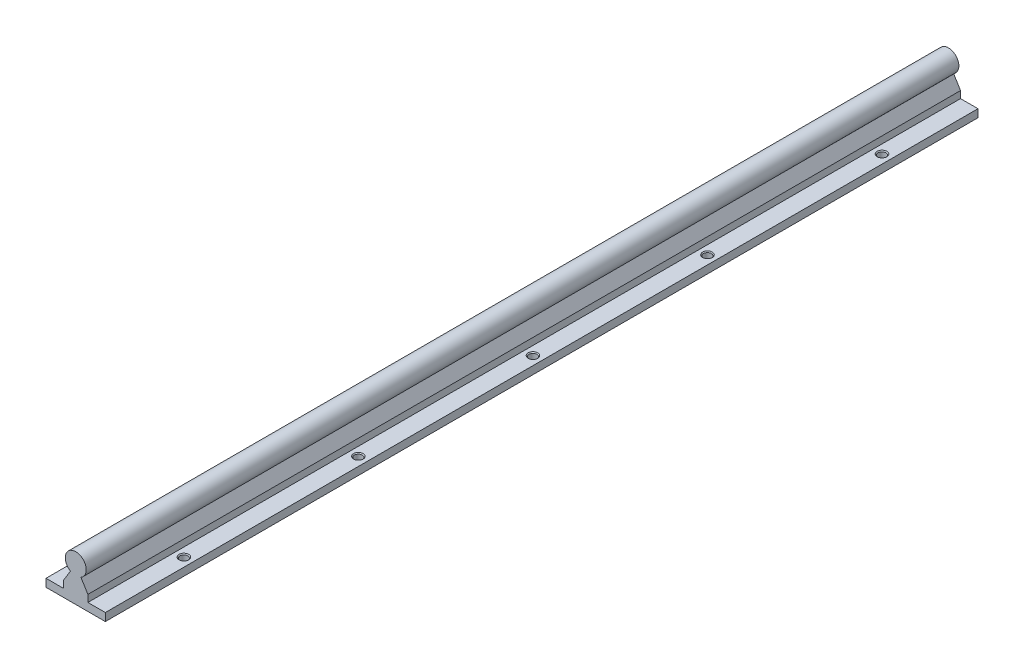
ISO-10303-21;
HEADER;
FILE_DESCRIPTION(('STEP AP214'),'2;1');
FILE_NAME('part.step','',(''),(''),'','','');
FILE_SCHEMA(('AUTOMOTIVE_DESIGN { 1 0 10303 214 1 1 1 1 }'));
ENDSEC;
DATA;
#1=APPLICATION_CONTEXT('core data for automotive mechanical design processes');
#2=APPLICATION_PROTOCOL_DEFINITION('international standard','automotive_design',2000,#1);
#3=PRODUCT_CONTEXT('',#1,'mechanical');
#4=PRODUCT('Part','Part','',(#3));
#5=PRODUCT_RELATED_PRODUCT_CATEGORY('part','',(#4));
#6=PRODUCT_DEFINITION_FORMATION('','',#4);
#7=PRODUCT_DEFINITION_CONTEXT('part definition',#1,'design');
#8=PRODUCT_DEFINITION('design','',#6,#7);
#9=PRODUCT_DEFINITION_SHAPE('','',#8);
#10=(LENGTH_UNIT() NAMED_UNIT(*) SI_UNIT(.MILLI.,.METRE.));
#11=(NAMED_UNIT(*) PLANE_ANGLE_UNIT() SI_UNIT($,.RADIAN.));
#12=(NAMED_UNIT(*) SI_UNIT($,.STERADIAN.) SOLID_ANGLE_UNIT());
#13=UNCERTAINTY_MEASURE_WITH_UNIT(LENGTH_MEASURE(1.E-05),#10,'distance_accuracy_value','');
#14=(GEOMETRIC_REPRESENTATION_CONTEXT(3) GLOBAL_UNCERTAINTY_ASSIGNED_CONTEXT((#13)) GLOBAL_UNIT_ASSIGNED_CONTEXT((#10,
#11,#12)) REPRESENTATION_CONTEXT('',''));
#15=CARTESIAN_POINT('',(0.,0.,0.));
#16=DIRECTION('',(0.,0.,1.));
#17=DIRECTION('',(1.,0.,0.));
#18=AXIS2_PLACEMENT_3D('',#15,#16,#17);
#19=CARTESIAN_POINT('',(-38.8854512776642,-15.3216429533087,500.));
#20=DIRECTION('',(1.,0.,0.));
#21=DIRECTION('',(0.,0.,-1.));
#22=AXIS2_PLACEMENT_3D('',#19,#20,#21);
#23=PLANE('',#22);
#24=DIRECTION('',(0.,-1.,0.));
#25=VECTOR('',#24,1.);
#26=CARTESIAN_POINT('',(-38.8854512776642,-15.3216429533087,0.));
#27=LINE('',#26,#25);
#28=CARTESIAN_POINT('',(-38.8854512776642,-15.3216429533087,0.));
#29=VERTEX_POINT('',#28);
#30=CARTESIAN_POINT('',(-38.8854512776642,-19.8216429533087,0.));
#31=VERTEX_POINT('',#30);
#32=EDGE_CURVE('E144',#29,#31,#27,.T.);
#33=ORIENTED_EDGE('',*,*,#32,.T.);
#34=DIRECTION('',(0.,0.,-1.));
#35=VECTOR('',#34,1.);
#36=CARTESIAN_POINT('',(-38.8854512776642,-19.8216429533087,500.));
#37=LINE('',#36,#35);
#38=CARTESIAN_POINT('',(-38.8854512776642,-19.8216429533087,500.));
#39=VERTEX_POINT('',#38);
#40=EDGE_CURVE('E11',#39,#31,#37,.T.);
#41=ORIENTED_EDGE('',*,*,#40,.F.);
#42=DIRECTION('',(0.,-1.,0.));
#43=VECTOR('',#42,1.);
#44=CARTESIAN_POINT('',(-38.8854512776642,-15.3216429533087,500.));
#45=LINE('',#44,#43);
#46=CARTESIAN_POINT('',(-38.8854512776642,-15.3216429533087,500.));
#47=VERTEX_POINT('',#46);
#48=EDGE_CURVE('E163',#47,#39,#45,.T.);
#49=ORIENTED_EDGE('',*,*,#48,.F.);
#50=DIRECTION('',(0.,0.,-1.));
#51=VECTOR('',#50,1.);
#52=CARTESIAN_POINT('',(-38.8854512776642,-15.3216429533087,500.));
#53=LINE('',#52,#51);
#54=EDGE_CURVE('E140',#47,#29,#53,.T.);
#55=ORIENTED_EDGE('',*,*,#54,.T.);
#56=EDGE_LOOP('',(#33,#41,#49,#55));
#57=FACE_BOUND('',#56,.T.);
#58=ADVANCED_FACE('F36',(#57),#23,.F.);
#59=CARTESIAN_POINT('',(-38.8854512776642,-19.8216429533087,500.));
#60=DIRECTION('',(0.,1.,0.));
#61=DIRECTION('',(0.,0.,1.));
#62=AXIS2_PLACEMENT_3D('',#59,#60,#61);
#63=PLANE('',#62);
#64=CARTESIAN_POINT('',(-33.8854512776642,-19.8216429533087,50.));
#65=DIRECTION('',(0.,1.,0.));
#66=DIRECTION('',(0.,0.,1.));
#67=AXIS2_PLACEMENT_3D('',#64,#65,#66);
#68=CIRCLE('',#67,2.25);
#69=CARTESIAN_POINT('',(-33.8854512776642,-19.8216429533087,52.25));
#70=VERTEX_POINT('',#69);
#71=EDGE_CURVE('E290',#70,#70,#68,.T.);
#72=ORIENTED_EDGE('',*,*,#71,.T.);
#73=EDGE_LOOP('',(#72));
#74=FACE_BOUND('',#73,.T.);
#75=CARTESIAN_POINT('',(-33.8854512776642,-19.8216429533087,150.));
#76=DIRECTION('',(0.,1.,0.));
#77=DIRECTION('',(0.,0.,1.));
#78=AXIS2_PLACEMENT_3D('',#75,#76,#77);
#79=CIRCLE('',#78,2.25);
#80=CARTESIAN_POINT('',(-33.8854512776642,-19.8216429533087,152.25));
#81=VERTEX_POINT('',#80);
#82=EDGE_CURVE('E281',#81,#81,#79,.T.);
#83=ORIENTED_EDGE('',*,*,#82,.T.);
#84=EDGE_LOOP('',(#83));
#85=FACE_BOUND('',#84,.T.);
#86=CARTESIAN_POINT('',(-33.8854512776642,-19.8216429533087,250.));
#87=DIRECTION('',(0.,1.,0.));
#88=DIRECTION('',(0.,0.,1.));
#89=AXIS2_PLACEMENT_3D('',#86,#87,#88);
#90=CIRCLE('',#89,2.25);
#91=CARTESIAN_POINT('',(-33.8854512776642,-19.8216429533087,252.25));
#92=VERTEX_POINT('',#91);
#93=EDGE_CURVE('E272',#92,#92,#90,.T.);
#94=ORIENTED_EDGE('',*,*,#93,.T.);
#95=EDGE_LOOP('',(#94));
#96=FACE_BOUND('',#95,.T.);
#97=CARTESIAN_POINT('',(-9.88545127766421,-19.8216429533087,250.));
#98=DIRECTION('',(0.,1.,0.));
#99=DIRECTION('',(0.,0.,1.));
#100=AXIS2_PLACEMENT_3D('',#97,#98,#99);
#101=CIRCLE('',#100,2.25);
#102=CARTESIAN_POINT('',(-9.88545127766421,-19.8216429533087,252.25));
#103=VERTEX_POINT('',#102);
#104=EDGE_CURVE('E263',#103,#103,#101,.T.);
#105=ORIENTED_EDGE('',*,*,#104,.T.);
#106=EDGE_LOOP('',(#105));
#107=FACE_BOUND('',#106,.T.);
#108=CARTESIAN_POINT('',(-9.88545127766421,-19.8216429533087,150.));
#109=DIRECTION('',(0.,1.,0.));
#110=DIRECTION('',(0.,0.,1.));
#111=AXIS2_PLACEMENT_3D('',#108,#109,#110);
#112=CIRCLE('',#111,2.25);
#113=CARTESIAN_POINT('',(-9.88545127766421,-19.8216429533087,152.25));
#114=VERTEX_POINT('',#113);
#115=EDGE_CURVE('E254',#114,#114,#112,.T.);
#116=ORIENTED_EDGE('',*,*,#115,.T.);
#117=EDGE_LOOP('',(#116));
#118=FACE_BOUND('',#117,.T.);
#119=CARTESIAN_POINT('',(-9.88545127766421,-19.8216429533087,50.));
#120=DIRECTION('',(0.,1.,0.));
#121=DIRECTION('',(0.,0.,1.));
#122=AXIS2_PLACEMENT_3D('',#119,#120,#121);
#123=CIRCLE('',#122,2.25);
#124=CARTESIAN_POINT('',(-9.88545127766421,-19.8216429533087,52.25));
#125=VERTEX_POINT('',#124);
#126=EDGE_CURVE('E245',#125,#125,#123,.T.);
#127=ORIENTED_EDGE('',*,*,#126,.T.);
#128=EDGE_LOOP('',(#127));
#129=FACE_BOUND('',#128,.T.);
#130=CARTESIAN_POINT('',(-9.88545127766421,-19.8216429533087,350.));
#131=DIRECTION('',(0.,1.,0.));
#132=DIRECTION('',(0.,0.,1.));
#133=AXIS2_PLACEMENT_3D('',#130,#131,#132);
#134=CIRCLE('',#133,2.25);
#135=CARTESIAN_POINT('',(-9.88545127766421,-19.8216429533087,352.25));
#136=VERTEX_POINT('',#135);
#137=EDGE_CURVE('E236',#136,#136,#134,.T.);
#138=ORIENTED_EDGE('',*,*,#137,.T.);
#139=EDGE_LOOP('',(#138));
#140=FACE_BOUND('',#139,.T.);
#141=CARTESIAN_POINT('',(-9.88545127766421,-19.8216429533087,450.));
#142=DIRECTION('',(0.,1.,0.));
#143=DIRECTION('',(0.,0.,1.));
#144=AXIS2_PLACEMENT_3D('',#141,#142,#143);
#145=CIRCLE('',#144,2.25);
#146=CARTESIAN_POINT('',(-9.88545127766421,-19.8216429533087,452.25));
#147=VERTEX_POINT('',#146);
#148=EDGE_CURVE('E227',#147,#147,#145,.T.);
#149=ORIENTED_EDGE('',*,*,#148,.T.);
#150=EDGE_LOOP('',(#149));
#151=FACE_BOUND('',#150,.T.);
#152=CARTESIAN_POINT('',(-33.8854512776642,-19.8216429533087,350.));
#153=DIRECTION('',(0.,1.,0.));
#154=DIRECTION('',(0.,0.,1.));
#155=AXIS2_PLACEMENT_3D('',#152,#153,#154);
#156=CIRCLE('',#155,2.25);
#157=CARTESIAN_POINT('',(-33.8854512776642,-19.8216429533087,352.25));
#158=VERTEX_POINT('',#157);
#159=EDGE_CURVE('E218',#158,#158,#156,.T.);
#160=ORIENTED_EDGE('',*,*,#159,.T.);
#161=EDGE_LOOP('',(#160));
#162=FACE_BOUND('',#161,.T.);
#163=CARTESIAN_POINT('',(-33.8854512776642,-19.8216429533087,450.));
#164=DIRECTION('',(0.,1.,0.));
#165=DIRECTION('',(0.,0.,1.));
#166=AXIS2_PLACEMENT_3D('',#163,#164,#165);
#167=CIRCLE('',#166,2.25);
#168=CARTESIAN_POINT('',(-33.8854512776642,-19.8216429533087,452.25));
#169=VERTEX_POINT('',#168);
#170=EDGE_CURVE('E148',#169,#169,#167,.T.);
#171=ORIENTED_EDGE('',*,*,#170,.T.);
#172=EDGE_LOOP('',(#171));
#173=FACE_BOUND('',#172,.T.);
#174=DIRECTION('',(1.,0.,0.));
#175=VECTOR('',#174,1.);
#176=CARTESIAN_POINT('',(-38.8854512776642,-19.8216429533087,0.));
#177=LINE('',#176,#175);
#178=CARTESIAN_POINT('',(-4.88545127766421,-19.8216429533087,0.));
#179=VERTEX_POINT('',#178);
#180=EDGE_CURVE('E147',#31,#179,#177,.T.);
#181=ORIENTED_EDGE('',*,*,#180,.T.);
#182=DIRECTION('',(0.,0.,-1.));
#183=VECTOR('',#182,1.);
#184=CARTESIAN_POINT('',(-4.88545127766421,-19.8216429533087,500.));
#185=LINE('',#184,#183);
#186=CARTESIAN_POINT('',(-4.88545127766421,-19.8216429533087,500.));
#187=VERTEX_POINT('',#186);
#188=EDGE_CURVE('E44',#187,#179,#185,.T.);
#189=ORIENTED_EDGE('',*,*,#188,.F.);
#190=DIRECTION('',(1.,0.,0.));
#191=VECTOR('',#190,1.);
#192=CARTESIAN_POINT('',(-38.8854512776642,-19.8216429533087,500.));
#193=LINE('',#192,#191);
#194=EDGE_CURVE('E101',#39,#187,#193,.T.);
#195=ORIENTED_EDGE('',*,*,#194,.F.);
#196=ORIENTED_EDGE('',*,*,#40,.T.);
#197=EDGE_LOOP('',(#181,#189,#195,#196));
#198=FACE_BOUND('',#197,.T.);
#199=ADVANCED_FACE('F331',(#74,#85,#96,#107,#118,#129,#140,#151,#162,#173,#198),#63,.F.);
#200=CARTESIAN_POINT('',(-4.88545127766421,-19.8216429533087,500.));
#201=DIRECTION('',(-1.,0.,0.));
#202=DIRECTION('',(0.,0.,1.));
#203=AXIS2_PLACEMENT_3D('',#200,#201,#202);
#204=PLANE('',#203);
#205=DIRECTION('',(0.,1.,0.));
#206=VECTOR('',#205,1.);
#207=CARTESIAN_POINT('',(-4.88545127766421,-19.8216429533087,0.));
#208=LINE('',#207,#206);
#209=CARTESIAN_POINT('',(-4.88545127766421,-15.3216429533087,0.));
#210=VERTEX_POINT('',#209);
#211=EDGE_CURVE('E150',#179,#210,#208,.T.);
#212=ORIENTED_EDGE('',*,*,#211,.T.);
#213=DIRECTION('',(0.,0.,-1.));
#214=VECTOR('',#213,1.);
#215=CARTESIAN_POINT('',(-4.88545127766421,-15.3216429533087,500.));
#216=LINE('',#215,#214);
#217=CARTESIAN_POINT('',(-4.88545127766421,-15.3216429533087,500.));
#218=VERTEX_POINT('',#217);
#219=EDGE_CURVE('E176',#218,#210,#216,.T.);
#220=ORIENTED_EDGE('',*,*,#219,.F.);
#221=DIRECTION('',(0.,1.,0.));
#222=VECTOR('',#221,1.);
#223=CARTESIAN_POINT('',(-4.88545127766421,-19.8216429533087,500.));
#224=LINE('',#223,#222);
#225=EDGE_CURVE('E184',#187,#218,#224,.T.);
#226=ORIENTED_EDGE('',*,*,#225,.F.);
#227=ORIENTED_EDGE('',*,*,#188,.T.);
#228=EDGE_LOOP('',(#212,#220,#226,#227));
#229=FACE_BOUND('',#228,.T.);
#230=ADVANCED_FACE('F182',(#229),#204,.F.);
#231=CARTESIAN_POINT('',(-4.88545127766421,-15.3216429533087,500.));
#232=DIRECTION('',(0.,-1.,0.));
#233=DIRECTION('',(0.,0.,-1.));
#234=AXIS2_PLACEMENT_3D('',#231,#232,#233);
#235=PLANE('',#234);
#236=CARTESIAN_POINT('',(-9.88545127766421,-15.3216429533087,250.));
#237=DIRECTION('',(0.,1.,0.));
#238=DIRECTION('',(0.,0.,1.));
#239=AXIS2_PLACEMENT_3D('',#236,#237,#238);
#240=CIRCLE('',#239,2.75);
#241=CARTESIAN_POINT('',(-9.88545127766421,-15.3216429533087,252.75));
#242=VERTEX_POINT('',#241);
#243=EDGE_CURVE('E269',#242,#242,#240,.T.);
#244=ORIENTED_EDGE('',*,*,#243,.F.);
#245=EDGE_LOOP('',(#244));
#246=FACE_BOUND('',#245,.T.);
#247=CARTESIAN_POINT('',(-9.88545127766421,-15.3216429533087,150.));
#248=DIRECTION('',(0.,1.,0.));
#249=DIRECTION('',(0.,0.,1.));
#250=AXIS2_PLACEMENT_3D('',#247,#248,#249);
#251=CIRCLE('',#250,2.75);
#252=CARTESIAN_POINT('',(-9.88545127766421,-15.3216429533087,152.75));
#253=VERTEX_POINT('',#252);
#254=EDGE_CURVE('E260',#253,#253,#251,.T.);
#255=ORIENTED_EDGE('',*,*,#254,.F.);
#256=EDGE_LOOP('',(#255));
#257=FACE_BOUND('',#256,.T.);
#258=CARTESIAN_POINT('',(-9.88545127766421,-15.3216429533087,50.));
#259=DIRECTION('',(0.,1.,0.));
#260=DIRECTION('',(0.,0.,1.));
#261=AXIS2_PLACEMENT_3D('',#258,#259,#260);
#262=CIRCLE('',#261,2.75);
#263=CARTESIAN_POINT('',(-9.88545127766421,-15.3216429533087,52.75));
#264=VERTEX_POINT('',#263);
#265=EDGE_CURVE('E251',#264,#264,#262,.T.);
#266=ORIENTED_EDGE('',*,*,#265,.F.);
#267=EDGE_LOOP('',(#266));
#268=FACE_BOUND('',#267,.T.);
#269=CARTESIAN_POINT('',(-9.88545127766421,-15.3216429533087,350.));
#270=DIRECTION('',(0.,1.,0.));
#271=DIRECTION('',(0.,0.,1.));
#272=AXIS2_PLACEMENT_3D('',#269,#270,#271);
#273=CIRCLE('',#272,2.75);
#274=CARTESIAN_POINT('',(-9.88545127766421,-15.3216429533087,352.75));
#275=VERTEX_POINT('',#274);
#276=EDGE_CURVE('E242',#275,#275,#273,.T.);
#277=ORIENTED_EDGE('',*,*,#276,.F.);
#278=EDGE_LOOP('',(#277));
#279=FACE_BOUND('',#278,.T.);
#280=CARTESIAN_POINT('',(-9.88545127766421,-15.3216429533087,450.));
#281=DIRECTION('',(0.,1.,0.));
#282=DIRECTION('',(0.,0.,1.));
#283=AXIS2_PLACEMENT_3D('',#280,#281,#282);
#284=CIRCLE('',#283,2.75);
#285=CARTESIAN_POINT('',(-9.88545127766421,-15.3216429533087,452.75));
#286=VERTEX_POINT('',#285);
#287=EDGE_CURVE('E233',#286,#286,#284,.T.);
#288=ORIENTED_EDGE('',*,*,#287,.F.);
#289=EDGE_LOOP('',(#288));
#290=FACE_BOUND('',#289,.T.);
#291=DIRECTION('',(-1.,0.,0.));
#292=VECTOR('',#291,1.);
#293=CARTESIAN_POINT('',(-4.88545127766421,-15.3216429533087,0.));
#294=LINE('',#293,#292);
#295=CARTESIAN_POINT('',(-14.8854512776642,-15.3216429533087,0.));
#296=VERTEX_POINT('',#295);
#297=EDGE_CURVE('E152',#210,#296,#294,.T.);
#298=ORIENTED_EDGE('',*,*,#297,.T.);
#299=DIRECTION('',(0.,0.,-1.));
#300=VECTOR('',#299,1.);
#301=CARTESIAN_POINT('',(-14.8854512776642,-15.3216429533087,500.));
#302=LINE('',#301,#300);
#303=CARTESIAN_POINT('',(-14.8854512776642,-15.3216429533087,500.));
#304=VERTEX_POINT('',#303);
#305=EDGE_CURVE('E173',#304,#296,#302,.T.);
#306=ORIENTED_EDGE('',*,*,#305,.F.);
#307=DIRECTION('',(-1.,0.,0.));
#308=VECTOR('',#307,1.);
#309=CARTESIAN_POINT('',(-4.88545127766421,-15.3216429533087,500.));
#310=LINE('',#309,#308);
#311=EDGE_CURVE('E202',#218,#304,#310,.T.);
#312=ORIENTED_EDGE('',*,*,#311,.F.);
#313=ORIENTED_EDGE('',*,*,#219,.T.);
#314=EDGE_LOOP('',(#298,#306,#312,#313));
#315=FACE_BOUND('',#314,.T.);
#316=ADVANCED_FACE('F193',(#246,#257,#268,#279,#290,#315),#235,.F.);
#317=CARTESIAN_POINT('',(-14.8854512776642,-15.3216429533087,500.));
#318=DIRECTION('',(-1.,0.,0.));
#319=DIRECTION('',(0.,-1.,0.));
#320=AXIS2_PLACEMENT_3D('',#317,#318,#319);
#321=PLANE('',#320);
#322=DIRECTION('',(0.,1.,0.));
#323=VECTOR('',#322,1.);
#324=CARTESIAN_POINT('',(-14.8854512776642,-15.3216429533087,0.));
#325=LINE('',#324,#323);
#326=CARTESIAN_POINT('',(-14.8854512776642,-11.3216429533087,0.));
#327=VERTEX_POINT('',#326);
#328=EDGE_CURVE('E154',#296,#327,#325,.T.);
#329=ORIENTED_EDGE('',*,*,#328,.T.);
#330=DIRECTION('',(0.,0.,-1.));
#331=VECTOR('',#330,1.);
#332=CARTESIAN_POINT('',(-14.8854512776642,-11.3216429533087,500.));
#333=LINE('',#332,#331);
#334=CARTESIAN_POINT('',(-14.8854512776642,-11.3216429533087,500.));
#335=VERTEX_POINT('',#334);
#336=EDGE_CURVE('E170',#335,#327,#333,.T.);
#337=ORIENTED_EDGE('',*,*,#336,.F.);
#338=DIRECTION('',(0.,1.,0.));
#339=VECTOR('',#338,1.);
#340=CARTESIAN_POINT('',(-14.8854512776642,-15.3216429533087,500.));
#341=LINE('',#340,#339);
#342=EDGE_CURVE('E199',#304,#335,#341,.T.);
#343=ORIENTED_EDGE('',*,*,#342,.F.);
#344=ORIENTED_EDGE('',*,*,#305,.T.);
#345=EDGE_LOOP('',(#329,#337,#343,#344));
#346=FACE_BOUND('',#345,.T.);
#347=ADVANCED_FACE('F197',(#346),#321,.F.);
#348=CARTESIAN_POINT('',(-14.8854512776642,-11.3216429533087,500.));
#349=DIRECTION('',(-0.851658316704544,-0.524097425664335,0.));
#350=DIRECTION('',(0.524097425664335,-0.851658316704544,0.));
#351=AXIS2_PLACEMENT_3D('',#348,#349,#350);
#352=PLANE('',#351);
#353=DIRECTION('',(-0.524097425664335,0.851658316704544,0.));
#354=VECTOR('',#353,1.);
#355=CARTESIAN_POINT('',(-14.8854512776642,-11.3216429533087,0.));
#356=LINE('',#355,#354);
#357=CARTESIAN_POINT('',(-18.8854512776642,-4.82164295330865,0.));
#358=VERTEX_POINT('',#357);
#359=EDGE_CURVE('E156',#327,#358,#356,.T.);
#360=ORIENTED_EDGE('',*,*,#359,.T.);
#361=DIRECTION('',(0.,0.,-1.));
#362=VECTOR('',#361,1.);
#363=CARTESIAN_POINT('',(-18.8854512776642,-4.82164295330865,500.));
#364=LINE('',#363,#362);
#365=CARTESIAN_POINT('',(-18.8854512776642,-4.82164295330865,500.));
#366=VERTEX_POINT('',#365);
#367=EDGE_CURVE('E167',#366,#358,#364,.T.);
#368=ORIENTED_EDGE('',*,*,#367,.F.);
#369=DIRECTION('',(-0.524097425664335,0.851658316704544,0.));
#370=VECTOR('',#369,1.);
#371=CARTESIAN_POINT('',(-14.8854512776642,-11.3216429533087,500.));
#372=LINE('',#371,#370);
#373=EDGE_CURVE('E201',#335,#366,#372,.T.);
#374=ORIENTED_EDGE('',*,*,#373,.F.);
#375=ORIENTED_EDGE('',*,*,#336,.T.);
#376=EDGE_LOOP('',(#360,#368,#374,#375));
#377=FACE_BOUND('',#376,.T.);
#378=ADVANCED_FACE('F344',(#377),#352,.F.);
#379=CARTESIAN_POINT('',(-21.8398824938442,0.40055353752367,500.));
#380=DIRECTION('',(0.,0.,-1.));
#381=DIRECTION('',(-1.,0.,0.));
#382=AXIS2_PLACEMENT_3D('',#379,#380,#381);
#383=CYLINDRICAL_SURFACE('',#382,6.);
#384=CARTESIAN_POINT('',(-21.8398824938442,0.40055353752367,0.));
#385=DIRECTION('',(0.,0.,1.));
#386=DIRECTION('',(1.,0.,0.));
#387=AXIS2_PLACEMENT_3D('',#384,#385,#386);
#388=CIRCLE('',#387,6.);
#389=CARTESIAN_POINT('',(-24.8854512776642,-4.76902195597876,0.));
#390=VERTEX_POINT('',#389);
#391=EDGE_CURVE('E158',#358,#390,#388,.T.);
#392=ORIENTED_EDGE('',*,*,#391,.T.);
#393=DIRECTION('',(0.,0.,-1.));
#394=VECTOR('',#393,1.);
#395=CARTESIAN_POINT('',(-24.8854512776642,-4.76902195597876,500.));
#396=LINE('',#395,#394);
#397=CARTESIAN_POINT('',(-24.8854512776642,-4.76902195597876,500.));
#398=VERTEX_POINT('',#397);
#399=EDGE_CURVE('E135',#398,#390,#396,.T.);
#400=ORIENTED_EDGE('',*,*,#399,.F.);
#401=CARTESIAN_POINT('',(-21.8398824938442,0.40055353752367,500.));
#402=DIRECTION('',(0.,0.,1.));
#403=DIRECTION('',(1.,0.,0.));
#404=AXIS2_PLACEMENT_3D('',#401,#402,#403);
#405=CIRCLE('',#404,6.);
#406=EDGE_CURVE('E126',#366,#398,#405,.T.);
#407=ORIENTED_EDGE('',*,*,#406,.F.);
#408=ORIENTED_EDGE('',*,*,#367,.T.);
#409=EDGE_LOOP('',(#392,#400,#407,#408));
#410=FACE_BOUND('',#409,.T.);
#411=ADVANCED_FACE('F341',(#410),#383,.T.);
#412=CARTESIAN_POINT('',(-24.8854512776642,-4.76902195597876,500.));
#413=DIRECTION('',(0.853535558568587,-0.521034596028912,0.));
#414=DIRECTION('',(0.521034596028912,0.853535558568586,0.));
#415=AXIS2_PLACEMENT_3D('',#412,#413,#414);
#416=PLANE('',#415);
#417=DIRECTION('',(-0.521034596028912,-0.853535558568586,0.));
#418=VECTOR('',#417,1.);
#419=CARTESIAN_POINT('',(-24.8854512776642,-4.76902195597876,0.));
#420=LINE('',#419,#418);
#421=CARTESIAN_POINT('',(-28.8854512776642,-11.3216429533087,0.));
#422=VERTEX_POINT('',#421);
#423=EDGE_CURVE('E134',#390,#422,#420,.T.);
#424=ORIENTED_EDGE('',*,*,#423,.T.);
#425=DIRECTION('',(0.,0.,-1.));
#426=VECTOR('',#425,1.);
#427=CARTESIAN_POINT('',(-28.8854512776642,-11.3216429533087,500.));
#428=LINE('',#427,#426);
#429=CARTESIAN_POINT('',(-28.8854512776642,-11.3216429533087,500.));
#430=VERTEX_POINT('',#429);
#431=EDGE_CURVE('E131',#430,#422,#428,.T.);
#432=ORIENTED_EDGE('',*,*,#431,.F.);
#433=DIRECTION('',(-0.521034596028912,-0.853535558568586,0.));
#434=VECTOR('',#433,1.);
#435=CARTESIAN_POINT('',(-24.8854512776642,-4.76902195597876,500.));
#436=LINE('',#435,#434);
#437=EDGE_CURVE('E120',#398,#430,#436,.T.);
#438=ORIENTED_EDGE('',*,*,#437,.F.);
#439=ORIENTED_EDGE('',*,*,#399,.T.);
#440=EDGE_LOOP('',(#424,#432,#438,#439));
#441=FACE_BOUND('',#440,.T.);
#442=ADVANCED_FACE('F132',(#441),#416,.F.);
#443=CARTESIAN_POINT('',(-28.8854512776642,-11.3216429533087,500.));
#444=DIRECTION('',(1.,0.,0.));
#445=DIRECTION('',(0.,0.,-1.));
#446=AXIS2_PLACEMENT_3D('',#443,#444,#445);
#447=PLANE('',#446);
#448=DIRECTION('',(0.,-1.,0.));
#449=VECTOR('',#448,1.);
#450=CARTESIAN_POINT('',(-28.8854512776642,-11.3216429533087,0.));
#451=LINE('',#450,#449);
#452=CARTESIAN_POINT('',(-28.8854512776642,-15.3216429533087,0.));
#453=VERTEX_POINT('',#452);
#454=EDGE_CURVE('E87',#422,#453,#451,.T.);
#455=ORIENTED_EDGE('',*,*,#454,.T.);
#456=DIRECTION('',(0.,0.,-1.));
#457=VECTOR('',#456,1.);
#458=CARTESIAN_POINT('',(-28.8854512776642,-15.3216429533087,500.));
#459=LINE('',#458,#457);
#460=CARTESIAN_POINT('',(-28.8854512776642,-15.3216429533087,500.));
#461=VERTEX_POINT('',#460);
#462=EDGE_CURVE('E136',#461,#453,#459,.T.);
#463=ORIENTED_EDGE('',*,*,#462,.F.);
#464=DIRECTION('',(0.,-1.,0.));
#465=VECTOR('',#464,1.);
#466=CARTESIAN_POINT('',(-28.8854512776642,-11.3216429533087,500.));
#467=LINE('',#466,#465);
#468=EDGE_CURVE('E124',#430,#461,#467,.T.);
#469=ORIENTED_EDGE('',*,*,#468,.F.);
#470=ORIENTED_EDGE('',*,*,#431,.T.);
#471=EDGE_LOOP('',(#455,#463,#469,#470));
#472=FACE_BOUND('',#471,.T.);
#473=ADVANCED_FACE('F138',(#472),#447,.F.);
#474=CARTESIAN_POINT('',(-28.8854512776642,-15.3216429533087,500.));
#475=DIRECTION('',(0.,-1.,0.));
#476=DIRECTION('',(1.,0.,0.));
#477=AXIS2_PLACEMENT_3D('',#474,#475,#476);
#478=PLANE('',#477);
#479=CARTESIAN_POINT('',(-33.8854512776642,-15.3216429533087,50.));
#480=DIRECTION('',(0.,1.,0.));
#481=DIRECTION('',(0.,0.,1.));
#482=AXIS2_PLACEMENT_3D('',#479,#480,#481);
#483=CIRCLE('',#482,2.75);
#484=CARTESIAN_POINT('',(-33.8854512776642,-15.3216429533087,52.75));
#485=VERTEX_POINT('',#484);
#486=EDGE_CURVE('E296',#485,#485,#483,.T.);
#487=ORIENTED_EDGE('',*,*,#486,.F.);
#488=EDGE_LOOP('',(#487));
#489=FACE_BOUND('',#488,.T.);
#490=CARTESIAN_POINT('',(-33.8854512776642,-15.3216429533087,150.));
#491=DIRECTION('',(0.,1.,0.));
#492=DIRECTION('',(0.,0.,1.));
#493=AXIS2_PLACEMENT_3D('',#490,#491,#492);
#494=CIRCLE('',#493,2.75);
#495=CARTESIAN_POINT('',(-33.8854512776642,-15.3216429533087,152.75));
#496=VERTEX_POINT('',#495);
#497=EDGE_CURVE('E287',#496,#496,#494,.T.);
#498=ORIENTED_EDGE('',*,*,#497,.F.);
#499=EDGE_LOOP('',(#498));
#500=FACE_BOUND('',#499,.T.);
#501=CARTESIAN_POINT('',(-33.8854512776642,-15.3216429533087,250.));
#502=DIRECTION('',(0.,1.,0.));
#503=DIRECTION('',(0.,0.,1.));
#504=AXIS2_PLACEMENT_3D('',#501,#502,#503);
#505=CIRCLE('',#504,2.75);
#506=CARTESIAN_POINT('',(-33.8854512776642,-15.3216429533087,252.75));
#507=VERTEX_POINT('',#506);
#508=EDGE_CURVE('E278',#507,#507,#505,.T.);
#509=ORIENTED_EDGE('',*,*,#508,.F.);
#510=EDGE_LOOP('',(#509));
#511=FACE_BOUND('',#510,.T.);
#512=CARTESIAN_POINT('',(-33.8854512776642,-15.3216429533087,350.));
#513=DIRECTION('',(0.,1.,0.));
#514=DIRECTION('',(0.,0.,1.));
#515=AXIS2_PLACEMENT_3D('',#512,#513,#514);
#516=CIRCLE('',#515,2.75);
#517=CARTESIAN_POINT('',(-33.8854512776642,-15.3216429533087,352.75));
#518=VERTEX_POINT('',#517);
#519=EDGE_CURVE('E224',#518,#518,#516,.T.);
#520=ORIENTED_EDGE('',*,*,#519,.F.);
#521=EDGE_LOOP('',(#520));
#522=FACE_BOUND('',#521,.T.);
#523=CARTESIAN_POINT('',(-33.8854512776642,-15.3216429533087,450.));
#524=DIRECTION('',(0.,1.,0.));
#525=DIRECTION('',(0.,0.,1.));
#526=AXIS2_PLACEMENT_3D('',#523,#524,#525);
#527=CIRCLE('',#526,2.75);
#528=CARTESIAN_POINT('',(-33.8854512776642,-15.3216429533087,452.75));
#529=VERTEX_POINT('',#528);
#530=EDGE_CURVE('E215',#529,#529,#527,.T.);
#531=ORIENTED_EDGE('',*,*,#530,.F.);
#532=EDGE_LOOP('',(#531));
#533=FACE_BOUND('',#532,.T.);
#534=DIRECTION('',(-1.,0.,0.));
#535=VECTOR('',#534,1.);
#536=CARTESIAN_POINT('',(-28.8854512776642,-15.3216429533087,0.));
#537=LINE('',#536,#535);
#538=EDGE_CURVE('E93',#453,#29,#537,.T.);
#539=ORIENTED_EDGE('',*,*,#538,.T.);
#540=ORIENTED_EDGE('',*,*,#54,.F.);
#541=DIRECTION('',(-1.,0.,0.));
#542=VECTOR('',#541,1.);
#543=CARTESIAN_POINT('',(-28.8854512776642,-15.3216429533087,500.));
#544=LINE('',#543,#542);
#545=EDGE_CURVE('E52',#461,#47,#544,.T.);
#546=ORIENTED_EDGE('',*,*,#545,.F.);
#547=ORIENTED_EDGE('',*,*,#462,.T.);
#548=EDGE_LOOP('',(#539,#540,#546,#547));
#549=FACE_BOUND('',#548,.T.);
#550=ADVANCED_FACE('F302',(#489,#500,#511,#522,#533,#549),#478,.F.);
#551=CARTESIAN_POINT('',(-21.8398824938442,0.40055353752367,500.));
#552=DIRECTION('',(0.,0.,1.));
#553=DIRECTION('',(1.,0.,0.));
#554=AXIS2_PLACEMENT_3D('',#551,#552,#553);
#555=PLANE('',#554);
#556=ORIENTED_EDGE('',*,*,#48,.T.);
#557=ORIENTED_EDGE('',*,*,#194,.T.);
#558=ORIENTED_EDGE('',*,*,#225,.T.);
#559=ORIENTED_EDGE('',*,*,#311,.T.);
#560=ORIENTED_EDGE('',*,*,#342,.T.);
#561=ORIENTED_EDGE('',*,*,#373,.T.);
#562=ORIENTED_EDGE('',*,*,#406,.T.);
#563=ORIENTED_EDGE('',*,*,#437,.T.);
#564=ORIENTED_EDGE('',*,*,#468,.T.);
#565=ORIENTED_EDGE('',*,*,#545,.T.);
#566=EDGE_LOOP('',(#556,#557,#558,#559,#560,#561,#562,#563,#564,#565));
#567=FACE_BOUND('',#566,.T.);
#568=ADVANCED_FACE('F122',(#567),#555,.T.);
#569=CARTESIAN_POINT('',(-21.8398824938442,0.40055353752367,0.));
#570=DIRECTION('',(0.,0.,1.));
#571=DIRECTION('',(1.,0.,0.));
#572=AXIS2_PLACEMENT_3D('',#569,#570,#571);
#573=PLANE('',#572);
#574=ORIENTED_EDGE('',*,*,#32,.F.);
#575=ORIENTED_EDGE('',*,*,#538,.F.);
#576=ORIENTED_EDGE('',*,*,#454,.F.);
#577=ORIENTED_EDGE('',*,*,#423,.F.);
#578=ORIENTED_EDGE('',*,*,#391,.F.);
#579=ORIENTED_EDGE('',*,*,#359,.F.);
#580=ORIENTED_EDGE('',*,*,#328,.F.);
#581=ORIENTED_EDGE('',*,*,#297,.F.);
#582=ORIENTED_EDGE('',*,*,#211,.F.);
#583=ORIENTED_EDGE('',*,*,#180,.F.);
#584=EDGE_LOOP('',(#574,#575,#576,#577,#578,#579,#580,#581,#582,#583));
#585=FACE_BOUND('',#584,.T.);
#586=ADVANCED_FACE('F188',(#585),#573,.F.);
#587=CARTESIAN_POINT('',(-33.8854512776642,-15.3216429533087,450.));
#588=DIRECTION('',(0.,1.,0.));
#589=DIRECTION('',(0.,0.,1.));
#590=AXIS2_PLACEMENT_3D('',#587,#588,#589);
#591=CYLINDRICAL_SURFACE('',#590,2.25);
#592=ORIENTED_EDGE('',*,*,#170,.F.);
#593=EDGE_LOOP('',(#592));
#594=FACE_BOUND('',#593,.T.);
#595=CARTESIAN_POINT('',(-33.8854512776642,-15.8216429533087,450.));
#596=DIRECTION('',(0.,1.,0.));
#597=DIRECTION('',(0.,0.,1.));
#598=AXIS2_PLACEMENT_3D('',#595,#596,#597);
#599=CIRCLE('',#598,2.25);
#600=CARTESIAN_POINT('',(-33.8854512776642,-15.8216429533087,452.25));
#601=VERTEX_POINT('',#600);
#602=EDGE_CURVE('E212',#601,#601,#599,.T.);
#603=ORIENTED_EDGE('',*,*,#602,.T.);
#604=EDGE_LOOP('',(#603));
#605=FACE_BOUND('',#604,.T.);
#606=ADVANCED_FACE('F317',(#594,#605),#591,.F.);
#607=CARTESIAN_POINT('',(-33.8854512776642,-15.3216429533087,450.));
#608=DIRECTION('',(0.,1.,0.));
#609=DIRECTION('',(0.,0.,1.));
#610=AXIS2_PLACEMENT_3D('',#607,#608,#609);
#611=CONICAL_SURFACE('',#610,2.75,0.785398163397445);
#612=ORIENTED_EDGE('',*,*,#602,.F.);
#613=EDGE_LOOP('',(#612));
#614=FACE_BOUND('',#613,.T.);
#615=ORIENTED_EDGE('',*,*,#530,.T.);
#616=EDGE_LOOP('',(#615));
#617=FACE_BOUND('',#616,.T.);
#618=ADVANCED_FACE('F314',(#614,#617),#611,.F.);
#619=CARTESIAN_POINT('',(-33.8854512776642,-15.3216429533087,350.));
#620=DIRECTION('',(0.,1.,0.));
#621=DIRECTION('',(0.,0.,1.));
#622=AXIS2_PLACEMENT_3D('',#619,#620,#621);
#623=CYLINDRICAL_SURFACE('',#622,2.25);
#624=ORIENTED_EDGE('',*,*,#159,.F.);
#625=EDGE_LOOP('',(#624));
#626=FACE_BOUND('',#625,.T.);
#627=CARTESIAN_POINT('',(-33.8854512776642,-15.8216429533087,350.));
#628=DIRECTION('',(0.,1.,0.));
#629=DIRECTION('',(0.,0.,1.));
#630=AXIS2_PLACEMENT_3D('',#627,#628,#629);
#631=CIRCLE('',#630,2.25);
#632=CARTESIAN_POINT('',(-33.8854512776642,-15.8216429533087,352.25));
#633=VERTEX_POINT('',#632);
#634=EDGE_CURVE('E221',#633,#633,#631,.T.);
#635=ORIENTED_EDGE('',*,*,#634,.T.);
#636=EDGE_LOOP('',(#635));
#637=FACE_BOUND('',#636,.T.);
#638=ADVANCED_FACE('F316',(#626,#637),#623,.F.);
#639=CARTESIAN_POINT('',(-33.8854512776642,-15.3216429533087,350.));
#640=DIRECTION('',(0.,1.,0.));
#641=DIRECTION('',(0.,0.,1.));
#642=AXIS2_PLACEMENT_3D('',#639,#640,#641);
#643=CONICAL_SURFACE('',#642,2.75,0.785398163397445);
#644=ORIENTED_EDGE('',*,*,#634,.F.);
#645=EDGE_LOOP('',(#644));
#646=FACE_BOUND('',#645,.T.);
#647=ORIENTED_EDGE('',*,*,#519,.T.);
#648=EDGE_LOOP('',(#647));
#649=FACE_BOUND('',#648,.T.);
#650=ADVANCED_FACE('F324',(#646,#649),#643,.F.);
#651=CARTESIAN_POINT('',(-9.88545127766421,-15.3216429533087,450.));
#652=DIRECTION('',(0.,1.,0.));
#653=DIRECTION('',(0.,0.,1.));
#654=AXIS2_PLACEMENT_3D('',#651,#652,#653);
#655=CYLINDRICAL_SURFACE('',#654,2.25);
#656=ORIENTED_EDGE('',*,*,#148,.F.);
#657=EDGE_LOOP('',(#656));
#658=FACE_BOUND('',#657,.T.);
#659=CARTESIAN_POINT('',(-9.88545127766421,-15.8216429533087,450.));
#660=DIRECTION('',(0.,1.,0.));
#661=DIRECTION('',(0.,0.,1.));
#662=AXIS2_PLACEMENT_3D('',#659,#660,#661);
#663=CIRCLE('',#662,2.25);
#664=CARTESIAN_POINT('',(-9.88545127766421,-15.8216429533087,452.25));
#665=VERTEX_POINT('',#664);
#666=EDGE_CURVE('E230',#665,#665,#663,.T.);
#667=ORIENTED_EDGE('',*,*,#666,.T.);
#668=EDGE_LOOP('',(#667));
#669=FACE_BOUND('',#668,.T.);
#670=ADVANCED_FACE('F453',(#658,#669),#655,.F.);
#671=CARTESIAN_POINT('',(-9.88545127766421,-15.3216429533087,450.));
#672=DIRECTION('',(0.,1.,0.));
#673=DIRECTION('',(0.,0.,1.));
#674=AXIS2_PLACEMENT_3D('',#671,#672,#673);
#675=CONICAL_SURFACE('',#674,2.75,0.785398163397446);
#676=ORIENTED_EDGE('',*,*,#666,.F.);
#677=EDGE_LOOP('',(#676));
#678=FACE_BOUND('',#677,.T.);
#679=ORIENTED_EDGE('',*,*,#287,.T.);
#680=EDGE_LOOP('',(#679));
#681=FACE_BOUND('',#680,.T.);
#682=ADVANCED_FACE('F463',(#678,#681),#675,.F.);
#683=CARTESIAN_POINT('',(-9.88545127766421,-15.3216429533087,350.));
#684=DIRECTION('',(0.,1.,0.));
#685=DIRECTION('',(0.,0.,1.));
#686=AXIS2_PLACEMENT_3D('',#683,#684,#685);
#687=CYLINDRICAL_SURFACE('',#686,2.25);
#688=ORIENTED_EDGE('',*,*,#137,.F.);
#689=EDGE_LOOP('',(#688));
#690=FACE_BOUND('',#689,.T.);
#691=CARTESIAN_POINT('',(-9.88545127766421,-15.8216429533087,350.));
#692=DIRECTION('',(0.,1.,0.));
#693=DIRECTION('',(0.,0.,1.));
#694=AXIS2_PLACEMENT_3D('',#691,#692,#693);
#695=CIRCLE('',#694,2.25);
#696=CARTESIAN_POINT('',(-9.88545127766421,-15.8216429533087,352.25));
#697=VERTEX_POINT('',#696);
#698=EDGE_CURVE('E239',#697,#697,#695,.T.);
#699=ORIENTED_EDGE('',*,*,#698,.T.);
#700=EDGE_LOOP('',(#699));
#701=FACE_BOUND('',#700,.T.);
#702=ADVANCED_FACE('F473',(#690,#701),#687,.F.);
#703=CARTESIAN_POINT('',(-9.88545127766421,-15.3216429533087,350.));
#704=DIRECTION('',(0.,1.,0.));
#705=DIRECTION('',(0.,0.,1.));
#706=AXIS2_PLACEMENT_3D('',#703,#704,#705);
#707=CONICAL_SURFACE('',#706,2.75,0.785398163397446);
#708=ORIENTED_EDGE('',*,*,#698,.F.);
#709=EDGE_LOOP('',(#708));
#710=FACE_BOUND('',#709,.T.);
#711=ORIENTED_EDGE('',*,*,#276,.T.);
#712=EDGE_LOOP('',(#711));
#713=FACE_BOUND('',#712,.T.);
#714=ADVANCED_FACE('F483',(#710,#713),#707,.F.);
#715=CARTESIAN_POINT('',(-9.88545127766421,-15.3216429533087,50.));
#716=DIRECTION('',(0.,1.,0.));
#717=DIRECTION('',(0.,0.,1.));
#718=AXIS2_PLACEMENT_3D('',#715,#716,#717);
#719=CYLINDRICAL_SURFACE('',#718,2.25);
#720=ORIENTED_EDGE('',*,*,#126,.F.);
#721=EDGE_LOOP('',(#720));
#722=FACE_BOUND('',#721,.T.);
#723=CARTESIAN_POINT('',(-9.88545127766421,-15.8216429533087,50.));
#724=DIRECTION('',(0.,1.,0.));
#725=DIRECTION('',(0.,0.,1.));
#726=AXIS2_PLACEMENT_3D('',#723,#724,#725);
#727=CIRCLE('',#726,2.25);
#728=CARTESIAN_POINT('',(-9.88545127766421,-15.8216429533087,52.25));
#729=VERTEX_POINT('',#728);
#730=EDGE_CURVE('E248',#729,#729,#727,.T.);
#731=ORIENTED_EDGE('',*,*,#730,.T.);
#732=EDGE_LOOP('',(#731));
#733=FACE_BOUND('',#732,.T.);
#734=ADVANCED_FACE('F493',(#722,#733),#719,.F.);
#735=CARTESIAN_POINT('',(-9.88545127766421,-15.3216429533087,50.));
#736=DIRECTION('',(0.,1.,0.));
#737=DIRECTION('',(0.,0.,1.));
#738=AXIS2_PLACEMENT_3D('',#735,#736,#737);
#739=CONICAL_SURFACE('',#738,2.75,0.785398163397446);
#740=ORIENTED_EDGE('',*,*,#730,.F.);
#741=EDGE_LOOP('',(#740));
#742=FACE_BOUND('',#741,.T.);
#743=ORIENTED_EDGE('',*,*,#265,.T.);
#744=EDGE_LOOP('',(#743));
#745=FACE_BOUND('',#744,.T.);
#746=ADVANCED_FACE('F503',(#742,#745),#739,.F.);
#747=CARTESIAN_POINT('',(-9.88545127766421,-15.3216429533087,150.));
#748=DIRECTION('',(0.,1.,0.));
#749=DIRECTION('',(0.,0.,1.));
#750=AXIS2_PLACEMENT_3D('',#747,#748,#749);
#751=CYLINDRICAL_SURFACE('',#750,2.25);
#752=ORIENTED_EDGE('',*,*,#115,.F.);
#753=EDGE_LOOP('',(#752));
#754=FACE_BOUND('',#753,.T.);
#755=CARTESIAN_POINT('',(-9.88545127766421,-15.8216429533087,150.));
#756=DIRECTION('',(0.,1.,0.));
#757=DIRECTION('',(0.,0.,1.));
#758=AXIS2_PLACEMENT_3D('',#755,#756,#757);
#759=CIRCLE('',#758,2.25);
#760=CARTESIAN_POINT('',(-9.88545127766421,-15.8216429533087,152.25));
#761=VERTEX_POINT('',#760);
#762=EDGE_CURVE('E257',#761,#761,#759,.T.);
#763=ORIENTED_EDGE('',*,*,#762,.T.);
#764=EDGE_LOOP('',(#763));
#765=FACE_BOUND('',#764,.T.);
#766=ADVANCED_FACE('F513',(#754,#765),#751,.F.);
#767=CARTESIAN_POINT('',(-9.88545127766421,-15.3216429533087,150.));
#768=DIRECTION('',(0.,1.,0.));
#769=DIRECTION('',(0.,0.,1.));
#770=AXIS2_PLACEMENT_3D('',#767,#768,#769);
#771=CONICAL_SURFACE('',#770,2.75,0.785398163397446);
#772=ORIENTED_EDGE('',*,*,#762,.F.);
#773=EDGE_LOOP('',(#772));
#774=FACE_BOUND('',#773,.T.);
#775=ORIENTED_EDGE('',*,*,#254,.T.);
#776=EDGE_LOOP('',(#775));
#777=FACE_BOUND('',#776,.T.);
#778=ADVANCED_FACE('F523',(#774,#777),#771,.F.);
#779=CARTESIAN_POINT('',(-9.88545127766421,-15.3216429533087,250.));
#780=DIRECTION('',(0.,1.,0.));
#781=DIRECTION('',(0.,0.,1.));
#782=AXIS2_PLACEMENT_3D('',#779,#780,#781);
#783=CYLINDRICAL_SURFACE('',#782,2.25);
#784=ORIENTED_EDGE('',*,*,#104,.F.);
#785=EDGE_LOOP('',(#784));
#786=FACE_BOUND('',#785,.T.);
#787=CARTESIAN_POINT('',(-9.88545127766421,-15.8216429533087,250.));
#788=DIRECTION('',(0.,1.,0.));
#789=DIRECTION('',(0.,0.,1.));
#790=AXIS2_PLACEMENT_3D('',#787,#788,#789);
#791=CIRCLE('',#790,2.25);
#792=CARTESIAN_POINT('',(-9.88545127766421,-15.8216429533087,252.25));
#793=VERTEX_POINT('',#792);
#794=EDGE_CURVE('E266',#793,#793,#791,.T.);
#795=ORIENTED_EDGE('',*,*,#794,.T.);
#796=EDGE_LOOP('',(#795));
#797=FACE_BOUND('',#796,.T.);
#798=ADVANCED_FACE('F533',(#786,#797),#783,.F.);
#799=CARTESIAN_POINT('',(-9.88545127766421,-15.3216429533087,250.));
#800=DIRECTION('',(0.,1.,0.));
#801=DIRECTION('',(0.,0.,1.));
#802=AXIS2_PLACEMENT_3D('',#799,#800,#801);
#803=CONICAL_SURFACE('',#802,2.75,0.785398163397446);
#804=ORIENTED_EDGE('',*,*,#794,.F.);
#805=EDGE_LOOP('',(#804));
#806=FACE_BOUND('',#805,.T.);
#807=ORIENTED_EDGE('',*,*,#243,.T.);
#808=EDGE_LOOP('',(#807));
#809=FACE_BOUND('',#808,.T.);
#810=ADVANCED_FACE('F543',(#806,#809),#803,.F.);
#811=CARTESIAN_POINT('',(-33.8854512776642,-15.3216429533087,250.));
#812=DIRECTION('',(0.,1.,0.));
#813=DIRECTION('',(0.,0.,1.));
#814=AXIS2_PLACEMENT_3D('',#811,#812,#813);
#815=CYLINDRICAL_SURFACE('',#814,2.25);
#816=ORIENTED_EDGE('',*,*,#93,.F.);
#817=EDGE_LOOP('',(#816));
#818=FACE_BOUND('',#817,.T.);
#819=CARTESIAN_POINT('',(-33.8854512776642,-15.8216429533087,250.));
#820=DIRECTION('',(0.,1.,0.));
#821=DIRECTION('',(0.,0.,1.));
#822=AXIS2_PLACEMENT_3D('',#819,#820,#821);
#823=CIRCLE('',#822,2.25);
#824=CARTESIAN_POINT('',(-33.8854512776642,-15.8216429533087,252.25));
#825=VERTEX_POINT('',#824);
#826=EDGE_CURVE('E275',#825,#825,#823,.T.);
#827=ORIENTED_EDGE('',*,*,#826,.T.);
#828=EDGE_LOOP('',(#827));
#829=FACE_BOUND('',#828,.T.);
#830=ADVANCED_FACE('F553',(#818,#829),#815,.F.);
#831=CARTESIAN_POINT('',(-33.8854512776642,-15.3216429533087,250.));
#832=DIRECTION('',(0.,1.,0.));
#833=DIRECTION('',(0.,0.,1.));
#834=AXIS2_PLACEMENT_3D('',#831,#832,#833);
#835=CONICAL_SURFACE('',#834,2.75,0.785398163397445);
#836=ORIENTED_EDGE('',*,*,#826,.F.);
#837=EDGE_LOOP('',(#836));
#838=FACE_BOUND('',#837,.T.);
#839=ORIENTED_EDGE('',*,*,#508,.T.);
#840=EDGE_LOOP('',(#839));
#841=FACE_BOUND('',#840,.T.);
#842=ADVANCED_FACE('F563',(#838,#841),#835,.F.);
#843=CARTESIAN_POINT('',(-33.8854512776642,-15.3216429533087,150.));
#844=DIRECTION('',(0.,1.,0.));
#845=DIRECTION('',(0.,0.,1.));
#846=AXIS2_PLACEMENT_3D('',#843,#844,#845);
#847=CYLINDRICAL_SURFACE('',#846,2.25);
#848=ORIENTED_EDGE('',*,*,#82,.F.);
#849=EDGE_LOOP('',(#848));
#850=FACE_BOUND('',#849,.T.);
#851=CARTESIAN_POINT('',(-33.8854512776642,-15.8216429533087,150.));
#852=DIRECTION('',(0.,1.,0.));
#853=DIRECTION('',(0.,0.,1.));
#854=AXIS2_PLACEMENT_3D('',#851,#852,#853);
#855=CIRCLE('',#854,2.25);
#856=CARTESIAN_POINT('',(-33.8854512776642,-15.8216429533087,152.25));
#857=VERTEX_POINT('',#856);
#858=EDGE_CURVE('E284',#857,#857,#855,.T.);
#859=ORIENTED_EDGE('',*,*,#858,.T.);
#860=EDGE_LOOP('',(#859));
#861=FACE_BOUND('',#860,.T.);
#862=ADVANCED_FACE('F573',(#850,#861),#847,.F.);
#863=CARTESIAN_POINT('',(-33.8854512776642,-15.3216429533087,150.));
#864=DIRECTION('',(0.,1.,0.));
#865=DIRECTION('',(0.,0.,1.));
#866=AXIS2_PLACEMENT_3D('',#863,#864,#865);
#867=CONICAL_SURFACE('',#866,2.75,0.785398163397445);
#868=ORIENTED_EDGE('',*,*,#858,.F.);
#869=EDGE_LOOP('',(#868));
#870=FACE_BOUND('',#869,.T.);
#871=ORIENTED_EDGE('',*,*,#497,.T.);
#872=EDGE_LOOP('',(#871));
#873=FACE_BOUND('',#872,.T.);
#874=ADVANCED_FACE('F583',(#870,#873),#867,.F.);
#875=CARTESIAN_POINT('',(-33.8854512776642,-15.3216429533087,50.));
#876=DIRECTION('',(0.,1.,0.));
#877=DIRECTION('',(0.,0.,1.));
#878=AXIS2_PLACEMENT_3D('',#875,#876,#877);
#879=CYLINDRICAL_SURFACE('',#878,2.25);
#880=ORIENTED_EDGE('',*,*,#71,.F.);
#881=EDGE_LOOP('',(#880));
#882=FACE_BOUND('',#881,.T.);
#883=CARTESIAN_POINT('',(-33.8854512776642,-15.8216429533087,50.));
#884=DIRECTION('',(0.,1.,0.));
#885=DIRECTION('',(0.,0.,1.));
#886=AXIS2_PLACEMENT_3D('',#883,#884,#885);
#887=CIRCLE('',#886,2.25);
#888=CARTESIAN_POINT('',(-33.8854512776642,-15.8216429533087,52.25));
#889=VERTEX_POINT('',#888);
#890=EDGE_CURVE('E293',#889,#889,#887,.T.);
#891=ORIENTED_EDGE('',*,*,#890,.T.);
#892=EDGE_LOOP('',(#891));
#893=FACE_BOUND('',#892,.T.);
#894=ADVANCED_FACE('F593',(#882,#893),#879,.F.);
#895=CARTESIAN_POINT('',(-33.8854512776642,-15.3216429533087,50.));
#896=DIRECTION('',(0.,1.,0.));
#897=DIRECTION('',(0.,0.,1.));
#898=AXIS2_PLACEMENT_3D('',#895,#896,#897);
#899=CONICAL_SURFACE('',#898,2.75,0.785398163397445);
#900=ORIENTED_EDGE('',*,*,#890,.F.);
#901=EDGE_LOOP('',(#900));
#902=FACE_BOUND('',#901,.T.);
#903=ORIENTED_EDGE('',*,*,#486,.T.);
#904=EDGE_LOOP('',(#903));
#905=FACE_BOUND('',#904,.T.);
#906=ADVANCED_FACE('F300',(#902,#905),#899,.F.);
#907=CLOSED_SHELL('',(#58,#199,#230,#316,#347,#378,#411,#442,#473,#550,#568,#586,#606,#618,#638,
#650,#670,#682,#702,#714,#734,#746,#766,#778,#798,#810,#830,#842,#862,#874,#894,#906));
#908=MANIFOLD_SOLID_BREP('B2',#907);
#909=ADVANCED_BREP_SHAPE_REPRESENTATION('',(#18,#908),#14);
#910=SHAPE_DEFINITION_REPRESENTATION(#9,#909);
ENDSEC;
END-ISO-10303-21;
